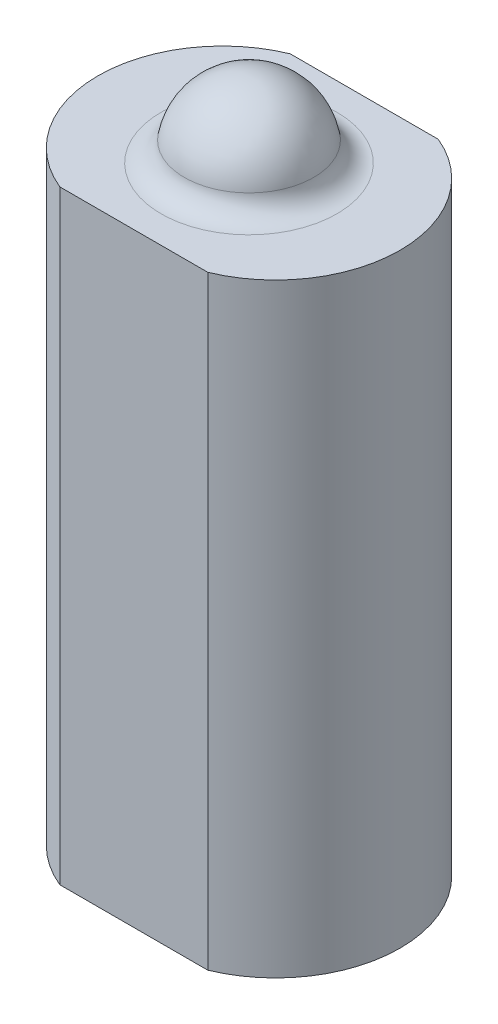
ISO-10303-21;
HEADER;
FILE_DESCRIPTION(('STEP AP214'),'2;1');
FILE_NAME('part.step','',(''),(''),'','','');
FILE_SCHEMA(('AUTOMOTIVE_DESIGN { 1 0 10303 214 1 1 1 1 }'));
ENDSEC;
DATA;
#1=APPLICATION_CONTEXT('core data for automotive mechanical design processes');
#2=APPLICATION_PROTOCOL_DEFINITION('international standard','automotive_design',2000,#1);
#3=PRODUCT_CONTEXT('',#1,'mechanical');
#4=PRODUCT('Part','Part','',(#3));
#5=PRODUCT_RELATED_PRODUCT_CATEGORY('part','',(#4));
#6=PRODUCT_DEFINITION_FORMATION('','',#4);
#7=PRODUCT_DEFINITION_CONTEXT('part definition',#1,'design');
#8=PRODUCT_DEFINITION('design','',#6,#7);
#9=PRODUCT_DEFINITION_SHAPE('','',#8);
#10=(LENGTH_UNIT() NAMED_UNIT(*) SI_UNIT(.MILLI.,.METRE.));
#11=(NAMED_UNIT(*) PLANE_ANGLE_UNIT() SI_UNIT($,.RADIAN.));
#12=(NAMED_UNIT(*) SI_UNIT($,.STERADIAN.) SOLID_ANGLE_UNIT());
#13=UNCERTAINTY_MEASURE_WITH_UNIT(LENGTH_MEASURE(1.E-05),#10,'distance_accuracy_value','');
#14=(GEOMETRIC_REPRESENTATION_CONTEXT(3) GLOBAL_UNCERTAINTY_ASSIGNED_CONTEXT((#13)) GLOBAL_UNIT_ASSIGNED_CONTEXT((#10,
#11,#12)) REPRESENTATION_CONTEXT('',''));
#15=CARTESIAN_POINT('',(0.,0.,0.));
#16=DIRECTION('',(0.,0.,1.));
#17=DIRECTION('',(1.,0.,0.));
#18=AXIS2_PLACEMENT_3D('',#15,#16,#17);
#19=CARTESIAN_POINT('',(-3.50527420380228,80.,0.));
#20=DIRECTION('',(0.,-1.,0.));
#21=DIRECTION('',(0.,0.,-1.));
#22=AXIS2_PLACEMENT_3D('',#19,#20,#21);
#23=CYLINDRICAL_SURFACE('',#22,16.4947257961977);
#24=CARTESIAN_POINT('',(-3.50527420380228,0.,0.));
#25=DIRECTION('',(0.,1.,0.));
#26=DIRECTION('',(0.,0.,1.));
#27=AXIS2_PLACEMENT_3D('',#24,#25,#26);
#28=CIRCLE('',#27,16.4947257961977);
#29=CARTESIAN_POINT('',(-9.79124899628678,0.,-15.25));
#30=VERTEX_POINT('',#29);
#31=CARTESIAN_POINT('',(-9.79124899628678,0.,15.25));
#32=VERTEX_POINT('',#31);
#33=EDGE_CURVE('E99',#30,#32,#28,.T.);
#34=ORIENTED_EDGE('',*,*,#33,.T.);
#35=DIRECTION('',(0.,-1.,0.));
#36=VECTOR('',#35,1.);
#37=CARTESIAN_POINT('',(-9.79124899628678,80.,15.25));
#38=LINE('',#37,#36);
#39=CARTESIAN_POINT('',(-9.79124899628678,80.,15.25));
#40=VERTEX_POINT('',#39);
#41=EDGE_CURVE('E41',#40,#32,#38,.T.);
#42=ORIENTED_EDGE('',*,*,#41,.F.);
#43=CARTESIAN_POINT('',(-3.50527420380228,80.,0.));
#44=DIRECTION('',(0.,1.,0.));
#45=DIRECTION('',(0.,0.,1.));
#46=AXIS2_PLACEMENT_3D('',#43,#44,#45);
#47=CIRCLE('',#46,16.4947257961977);
#48=CARTESIAN_POINT('',(-9.79124899628678,80.,-15.25));
#49=VERTEX_POINT('',#48);
#50=EDGE_CURVE('E85',#49,#40,#47,.T.);
#51=ORIENTED_EDGE('',*,*,#50,.F.);
#52=DIRECTION('',(0.,-1.,0.));
#53=VECTOR('',#52,1.);
#54=CARTESIAN_POINT('',(-9.79124899628678,80.,-15.25));
#55=LINE('',#54,#53);
#56=EDGE_CURVE('E95',#49,#30,#55,.T.);
#57=ORIENTED_EDGE('',*,*,#56,.T.);
#58=EDGE_LOOP('',(#34,#42,#51,#57));
#59=FACE_BOUND('',#58,.T.);
#60=ADVANCED_FACE('F33',(#59),#23,.T.);
#61=CARTESIAN_POINT('',(9.79124899628678,80.,15.25));
#62=DIRECTION('',(0.,0.,-1.));
#63=DIRECTION('',(-1.,0.,0.));
#64=AXIS2_PLACEMENT_3D('',#61,#62,#63);
#65=PLANE('',#64);
#66=DIRECTION('',(1.,0.,0.));
#67=VECTOR('',#66,1.);
#68=CARTESIAN_POINT('',(9.79124899628678,0.,15.25));
#69=LINE('',#68,#67);
#70=CARTESIAN_POINT('',(9.79124899628678,0.,15.25));
#71=VERTEX_POINT('',#70);
#72=EDGE_CURVE('E90',#32,#71,#69,.T.);
#73=ORIENTED_EDGE('',*,*,#72,.T.);
#74=DIRECTION('',(0.,-1.,0.));
#75=VECTOR('',#74,1.);
#76=CARTESIAN_POINT('',(9.79124899628678,80.,15.25));
#77=LINE('',#76,#75);
#78=CARTESIAN_POINT('',(9.79124899628678,80.,15.25));
#79=VERTEX_POINT('',#78);
#80=EDGE_CURVE('E88',#79,#71,#77,.T.);
#81=ORIENTED_EDGE('',*,*,#80,.F.);
#82=DIRECTION('',(1.,0.,0.));
#83=VECTOR('',#82,1.);
#84=CARTESIAN_POINT('',(9.79124899628678,80.,15.25));
#85=LINE('',#84,#83);
#86=EDGE_CURVE('E80',#40,#79,#85,.T.);
#87=ORIENTED_EDGE('',*,*,#86,.F.);
#88=ORIENTED_EDGE('',*,*,#41,.T.);
#89=EDGE_LOOP('',(#73,#81,#87,#88));
#90=FACE_BOUND('',#89,.T.);
#91=ADVANCED_FACE('F89',(#90),#65,.F.);
#92=CARTESIAN_POINT('',(3.50527420380228,80.,0.));
#93=DIRECTION('',(0.,-1.,0.));
#94=DIRECTION('',(0.,0.,-1.));
#95=AXIS2_PLACEMENT_3D('',#92,#93,#94);
#96=CYLINDRICAL_SURFACE('',#95,16.4947257961977);
#97=CARTESIAN_POINT('',(3.50527420380228,0.,0.));
#98=DIRECTION('',(0.,1.,0.));
#99=DIRECTION('',(0.,0.,-1.));
#100=AXIS2_PLACEMENT_3D('',#97,#98,#99);
#101=CIRCLE('',#100,16.4947257961977);
#102=CARTESIAN_POINT('',(9.79124899628678,0.,-15.25));
#103=VERTEX_POINT('',#102);
#104=EDGE_CURVE('E66',#71,#103,#101,.T.);
#105=ORIENTED_EDGE('',*,*,#104,.T.);
#106=DIRECTION('',(0.,-1.,0.));
#107=VECTOR('',#106,1.);
#108=CARTESIAN_POINT('',(9.79124899628678,80.,-15.25));
#109=LINE('',#108,#107);
#110=CARTESIAN_POINT('',(9.79124899628678,80.,-15.25));
#111=VERTEX_POINT('',#110);
#112=EDGE_CURVE('E91',#111,#103,#109,.T.);
#113=ORIENTED_EDGE('',*,*,#112,.F.);
#114=CARTESIAN_POINT('',(3.50527420380228,80.,0.));
#115=DIRECTION('',(0.,1.,0.));
#116=DIRECTION('',(0.,0.,-1.));
#117=AXIS2_PLACEMENT_3D('',#114,#115,#116);
#118=CIRCLE('',#117,16.4947257961977);
#119=EDGE_CURVE('E83',#79,#111,#118,.T.);
#120=ORIENTED_EDGE('',*,*,#119,.F.);
#121=ORIENTED_EDGE('',*,*,#80,.T.);
#122=EDGE_LOOP('',(#105,#113,#120,#121));
#123=FACE_BOUND('',#122,.T.);
#124=ADVANCED_FACE('F93',(#123),#96,.T.);
#125=CARTESIAN_POINT('',(-9.79124899628678,80.,-15.25));
#126=DIRECTION('',(0.,0.,1.));
#127=DIRECTION('',(1.,0.,0.));
#128=AXIS2_PLACEMENT_3D('',#125,#126,#127);
#129=PLANE('',#128);
#130=DIRECTION('',(-1.,0.,0.));
#131=VECTOR('',#130,1.);
#132=CARTESIAN_POINT('',(-9.79124899628678,0.,-15.25));
#133=LINE('',#132,#131);
#134=EDGE_CURVE('E72',#103,#30,#133,.T.);
#135=ORIENTED_EDGE('',*,*,#134,.T.);
#136=ORIENTED_EDGE('',*,*,#56,.F.);
#137=DIRECTION('',(-1.,0.,0.));
#138=VECTOR('',#137,1.);
#139=CARTESIAN_POINT('',(-9.79124899628678,80.,-15.25));
#140=LINE('',#139,#138);
#141=EDGE_CURVE('E49',#111,#49,#140,.T.);
#142=ORIENTED_EDGE('',*,*,#141,.F.);
#143=ORIENTED_EDGE('',*,*,#112,.T.);
#144=EDGE_LOOP('',(#135,#136,#142,#143));
#145=FACE_BOUND('',#144,.T.);
#146=ADVANCED_FACE('F121',(#145),#129,.F.);
#147=CARTESIAN_POINT('',(-3.50527420380228,80.,0.));
#148=DIRECTION('',(0.,1.,0.));
#149=DIRECTION('',(0.,0.,1.));
#150=AXIS2_PLACEMENT_3D('',#147,#148,#149);
#151=PLANE('',#150);
#152=CARTESIAN_POINT('',(0.,80.,0.));
#153=DIRECTION('',(0.,-1.,0.));
#154=DIRECTION('',(0.,0.,-1.));
#155=AXIS2_PLACEMENT_3D('',#152,#153,#154);
#156=CIRCLE('',#155,11.641855062507);
#157=CARTESIAN_POINT('',(0.,80.,-11.641855062507));
#158=VERTEX_POINT('',#157);
#159=EDGE_CURVE('E11',#158,#158,#156,.F.);
#160=ORIENTED_EDGE('',*,*,#159,.F.);
#161=EDGE_LOOP('',(#160));
#162=FACE_BOUND('',#161,.T.);
#163=ORIENTED_EDGE('',*,*,#50,.T.);
#164=ORIENTED_EDGE('',*,*,#86,.T.);
#165=ORIENTED_EDGE('',*,*,#119,.T.);
#166=ORIENTED_EDGE('',*,*,#141,.T.);
#167=EDGE_LOOP('',(#163,#164,#165,#166));
#168=FACE_BOUND('',#167,.T.);
#169=ADVANCED_FACE('F81',(#162,#168),#151,.T.);
#170=CARTESIAN_POINT('',(-3.50527420380228,0.,0.));
#171=DIRECTION('',(0.,1.,0.));
#172=DIRECTION('',(0.,0.,1.));
#173=AXIS2_PLACEMENT_3D('',#170,#171,#172);
#174=PLANE('',#173);
#175=ORIENTED_EDGE('',*,*,#33,.F.);
#176=ORIENTED_EDGE('',*,*,#134,.F.);
#177=ORIENTED_EDGE('',*,*,#104,.F.);
#178=ORIENTED_EDGE('',*,*,#72,.F.);
#179=EDGE_LOOP('',(#175,#176,#177,#178));
#180=FACE_BOUND('',#179,.T.);
#181=ADVANCED_FACE('F110',(#180),#174,.F.);
#182=CARTESIAN_POINT('',(0.,81.2487414787701,0.));
#183=DIRECTION('',(0.,-1.,0.));
#184=DIRECTION('',(0.,0.,-1.));
#185=AXIS2_PLACEMENT_3D('',#182,#183,#184);
#186=SPHERICAL_SURFACE('',#185,8.67031565225698);
#187=CARTESIAN_POINT('',(0.,82.6255328264601,0.));
#188=DIRECTION('',(0.,-1.,0.));
#189=DIRECTION('',(0.,0.,-1.));
#190=AXIS2_PLACEMENT_3D('',#187,#188,#189);
#191=CIRCLE('',#190,8.56030484823399);
#192=CARTESIAN_POINT('',(0.,82.6255328264601,-8.56030484823399));
#193=VERTEX_POINT('',#192);
#194=EDGE_CURVE('E102',#193,#193,#191,.T.);
#195=ORIENTED_EDGE('',*,*,#194,.F.);
#196=EDGE_LOOP('',(#195));
#197=FACE_BOUND('',#196,.T.);
#198=ADVANCED_FACE('F112',(#197),#186,.T.);
#199=CARTESIAN_POINT('',(0.,83.1211520535439,0.));
#200=DIRECTION('',(0.,-1.,0.));
#201=DIRECTION('',(0.,0.,-1.));
#202=AXIS2_PLACEMENT_3D('',#199,#200,#201);
#203=TOROIDAL_SURFACE('',#202,11.641855062507,3.12115205354391);
#204=ORIENTED_EDGE('',*,*,#194,.T.);
#205=EDGE_LOOP('',(#204));
#206=FACE_BOUND('',#205,.T.);
#207=ORIENTED_EDGE('',*,*,#159,.T.);
#208=EDGE_LOOP('',(#207));
#209=FACE_BOUND('',#208,.T.);
#210=ADVANCED_FACE('F118',(#206,#209),#203,.F.);
#211=CLOSED_SHELL('',(#60,#91,#124,#146,#169,#181,#198,#210));
#212=MANIFOLD_SOLID_BREP('B2',#211);
#213=ADVANCED_BREP_SHAPE_REPRESENTATION('',(#18,#212),#14);
#214=SHAPE_DEFINITION_REPRESENTATION(#9,#213);
ENDSEC;
END-ISO-10303-21;
